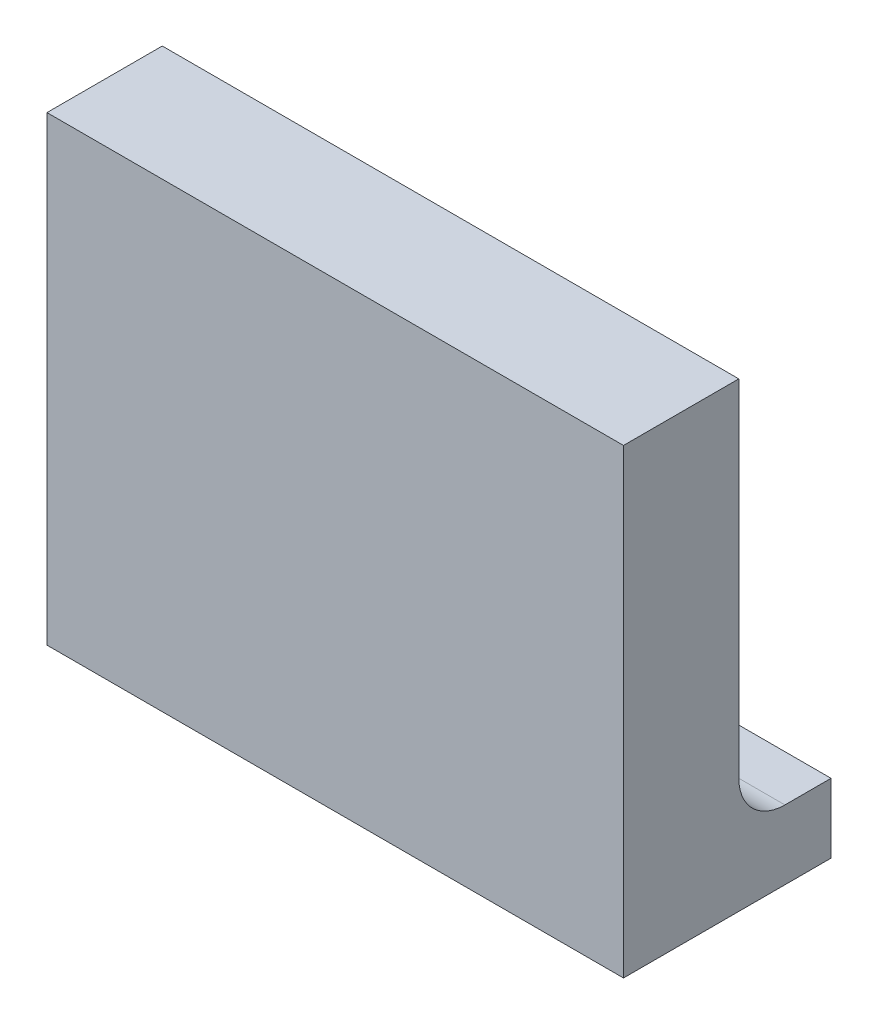
ISO-10303-21;
HEADER;
FILE_DESCRIPTION(('STEP AP214'),'2;1');
FILE_NAME('part.step','',(''),(''),'','','');
FILE_SCHEMA(('AUTOMOTIVE_DESIGN { 1 0 10303 214 1 1 1 1 }'));
ENDSEC;
DATA;
#1=APPLICATION_CONTEXT('core data for automotive mechanical design processes');
#2=APPLICATION_PROTOCOL_DEFINITION('international standard','automotive_design',2000,#1);
#3=PRODUCT_CONTEXT('',#1,'mechanical');
#4=PRODUCT('Part','Part','',(#3));
#5=PRODUCT_RELATED_PRODUCT_CATEGORY('part','',(#4));
#6=PRODUCT_DEFINITION_FORMATION('','',#4);
#7=PRODUCT_DEFINITION_CONTEXT('part definition',#1,'design');
#8=PRODUCT_DEFINITION('design','',#6,#7);
#9=PRODUCT_DEFINITION_SHAPE('','',#8);
#10=(LENGTH_UNIT() NAMED_UNIT(*) SI_UNIT(.MILLI.,.METRE.));
#11=(NAMED_UNIT(*) PLANE_ANGLE_UNIT() SI_UNIT($,.RADIAN.));
#12=(NAMED_UNIT(*) SI_UNIT($,.STERADIAN.) SOLID_ANGLE_UNIT());
#13=UNCERTAINTY_MEASURE_WITH_UNIT(LENGTH_MEASURE(1.E-05),#10,'distance_accuracy_value','');
#14=(GEOMETRIC_REPRESENTATION_CONTEXT(3) GLOBAL_UNCERTAINTY_ASSIGNED_CONTEXT((#13)) GLOBAL_UNIT_ASSIGNED_CONTEXT((#10,
#11,#12)) REPRESENTATION_CONTEXT('',''));
#15=CARTESIAN_POINT('',(0.,0.,0.));
#16=DIRECTION('',(0.,0.,1.));
#17=DIRECTION('',(1.,0.,0.));
#18=AXIS2_PLACEMENT_3D('',#15,#16,#17);
#19=CARTESIAN_POINT('',(25.,3.,0.));
#20=DIRECTION('',(0.,0.,1.));
#21=DIRECTION('',(1.,0.,0.));
#22=AXIS2_PLACEMENT_3D('',#19,#20,#21);
#23=PLANE('',#22);
#24=DIRECTION('',(0.,1.,0.));
#25=VECTOR('',#24,1.);
#26=CARTESIAN_POINT('',(0.,3.,0.));
#27=LINE('',#26,#25);
#28=CARTESIAN_POINT('',(0.,0.,0.));
#29=VERTEX_POINT('',#28);
#30=CARTESIAN_POINT('',(0.,3.,0.));
#31=VERTEX_POINT('',#30);
#32=EDGE_CURVE('E109',#29,#31,#27,.T.);
#33=ORIENTED_EDGE('',*,*,#32,.T.);
#34=DIRECTION('',(-1.,0.,0.));
#35=VECTOR('',#34,1.);
#36=CARTESIAN_POINT('',(25.,3.,0.));
#37=LINE('',#36,#35);
#38=CARTESIAN_POINT('',(25.,3.,0.));
#39=VERTEX_POINT('',#38);
#40=EDGE_CURVE('E92',#39,#31,#37,.T.);
#41=ORIENTED_EDGE('',*,*,#40,.F.);
#42=DIRECTION('',(0.,1.,0.));
#43=VECTOR('',#42,1.);
#44=CARTESIAN_POINT('',(25.,3.,0.));
#45=LINE('',#44,#43);
#46=CARTESIAN_POINT('',(25.,0.,0.));
#47=VERTEX_POINT('',#46);
#48=EDGE_CURVE('E97',#47,#39,#45,.T.);
#49=ORIENTED_EDGE('',*,*,#48,.F.);
#50=DIRECTION('',(-1.,0.,0.));
#51=VECTOR('',#50,1.);
#52=CARTESIAN_POINT('',(25.,0.,0.));
#53=LINE('',#52,#51);
#54=EDGE_CURVE('E125',#47,#29,#53,.T.);
#55=ORIENTED_EDGE('',*,*,#54,.T.);
#56=EDGE_LOOP('',(#33,#41,#49,#55));
#57=FACE_BOUND('',#56,.T.);
#58=ADVANCED_FACE('F33',(#57),#23,.F.);
#59=CARTESIAN_POINT('',(25.,3.,4.));
#60=DIRECTION('',(0.,-1.,0.));
#61=DIRECTION('',(0.,0.,-1.));
#62=AXIS2_PLACEMENT_3D('',#59,#60,#61);
#63=PLANE('',#62);
#64=DIRECTION('',(0.,0.,1.));
#65=VECTOR('',#64,1.);
#66=CARTESIAN_POINT('',(0.,3.,4.));
#67=LINE('',#66,#65);
#68=CARTESIAN_POINT('',(0.,3.,2.));
#69=VERTEX_POINT('',#68);
#70=EDGE_CURVE('E134',#31,#69,#67,.T.);
#71=ORIENTED_EDGE('',*,*,#70,.T.);
#72=DIRECTION('',(-1.,0.,0.));
#73=VECTOR('',#72,1.);
#74=CARTESIAN_POINT('',(25.,3.,2.));
#75=LINE('',#74,#73);
#76=CARTESIAN_POINT('',(25.,3.,2.));
#77=VERTEX_POINT('',#76);
#78=EDGE_CURVE('E48',#69,#77,#75,.F.);
#79=ORIENTED_EDGE('',*,*,#78,.T.);
#80=DIRECTION('',(0.,0.,1.));
#81=VECTOR('',#80,1.);
#82=CARTESIAN_POINT('',(25.,3.,4.));
#83=LINE('',#82,#81);
#84=EDGE_CURVE('E88',#39,#77,#83,.T.);
#85=ORIENTED_EDGE('',*,*,#84,.F.);
#86=ORIENTED_EDGE('',*,*,#40,.T.);
#87=EDGE_LOOP('',(#71,#79,#85,#86));
#88=FACE_BOUND('',#87,.T.);
#89=ADVANCED_FACE('F90',(#88),#63,.F.);
#90=CARTESIAN_POINT('',(25.,20.,4.));
#91=DIRECTION('',(0.,0.,1.));
#92=DIRECTION('',(0.,-1.,0.));
#93=AXIS2_PLACEMENT_3D('',#90,#91,#92);
#94=PLANE('',#93);
#95=DIRECTION('',(0.,1.,0.));
#96=VECTOR('',#95,1.);
#97=CARTESIAN_POINT('',(25.,20.,4.));
#98=LINE('',#97,#96);
#99=CARTESIAN_POINT('',(25.,5.,4.));
#100=VERTEX_POINT('',#99);
#101=CARTESIAN_POINT('',(25.,20.,4.));
#102=VERTEX_POINT('',#101);
#103=EDGE_CURVE('E96',#100,#102,#98,.T.);
#104=ORIENTED_EDGE('',*,*,#103,.F.);
#105=DIRECTION('',(-1.,0.,0.));
#106=VECTOR('',#105,1.);
#107=CARTESIAN_POINT('',(0.,5.,4.));
#108=LINE('',#107,#106);
#109=CARTESIAN_POINT('',(0.,5.,4.));
#110=VERTEX_POINT('',#109);
#111=EDGE_CURVE('E110',#100,#110,#108,.T.);
#112=ORIENTED_EDGE('',*,*,#111,.T.);
#113=DIRECTION('',(0.,1.,0.));
#114=VECTOR('',#113,1.);
#115=CARTESIAN_POINT('',(0.,20.,4.));
#116=LINE('',#115,#114);
#117=CARTESIAN_POINT('',(0.,20.,4.));
#118=VERTEX_POINT('',#117);
#119=EDGE_CURVE('E132',#110,#118,#116,.T.);
#120=ORIENTED_EDGE('',*,*,#119,.T.);
#121=DIRECTION('',(-1.,0.,0.));
#122=VECTOR('',#121,1.);
#123=CARTESIAN_POINT('',(25.,20.,4.));
#124=LINE('',#123,#122);
#125=EDGE_CURVE('E111',#102,#118,#124,.T.);
#126=ORIENTED_EDGE('',*,*,#125,.F.);
#127=EDGE_LOOP('',(#104,#112,#120,#126));
#128=FACE_BOUND('',#127,.T.);
#129=ADVANCED_FACE('F148',(#128),#94,.F.);
#130=CARTESIAN_POINT('',(25.,20.,9.));
#131=DIRECTION('',(0.,-1.,0.));
#132=DIRECTION('',(0.,0.,-1.));
#133=AXIS2_PLACEMENT_3D('',#130,#131,#132);
#134=PLANE('',#133);
#135=DIRECTION('',(0.,0.,1.));
#136=VECTOR('',#135,1.);
#137=CARTESIAN_POINT('',(0.,20.,9.));
#138=LINE('',#137,#136);
#139=CARTESIAN_POINT('',(0.,20.,9.));
#140=VERTEX_POINT('',#139);
#141=EDGE_CURVE('E130',#118,#140,#138,.T.);
#142=ORIENTED_EDGE('',*,*,#141,.T.);
#143=DIRECTION('',(-1.,0.,0.));
#144=VECTOR('',#143,1.);
#145=CARTESIAN_POINT('',(25.,20.,9.));
#146=LINE('',#145,#144);
#147=CARTESIAN_POINT('',(25.,20.,9.));
#148=VERTEX_POINT('',#147);
#149=EDGE_CURVE('E116',#148,#140,#146,.T.);
#150=ORIENTED_EDGE('',*,*,#149,.F.);
#151=DIRECTION('',(0.,0.,1.));
#152=VECTOR('',#151,1.);
#153=CARTESIAN_POINT('',(25.,20.,9.));
#154=LINE('',#153,#152);
#155=EDGE_CURVE('E140',#102,#148,#154,.T.);
#156=ORIENTED_EDGE('',*,*,#155,.F.);
#157=ORIENTED_EDGE('',*,*,#125,.T.);
#158=EDGE_LOOP('',(#142,#150,#156,#157));
#159=FACE_BOUND('',#158,.T.);
#160=ADVANCED_FACE('F151',(#159),#134,.F.);
#161=CARTESIAN_POINT('',(25.,0.,9.));
#162=DIRECTION('',(0.,0.,-1.));
#163=DIRECTION('',(-1.,0.,0.));
#164=AXIS2_PLACEMENT_3D('',#161,#162,#163);
#165=PLANE('',#164);
#166=DIRECTION('',(0.,-1.,0.));
#167=VECTOR('',#166,1.);
#168=CARTESIAN_POINT('',(0.,0.,9.));
#169=LINE('',#168,#167);
#170=CARTESIAN_POINT('',(0.,0.,9.));
#171=VERTEX_POINT('',#170);
#172=EDGE_CURVE('E128',#140,#171,#169,.T.);
#173=ORIENTED_EDGE('',*,*,#172,.T.);
#174=DIRECTION('',(-1.,0.,0.));
#175=VECTOR('',#174,1.);
#176=CARTESIAN_POINT('',(25.,0.,9.));
#177=LINE('',#176,#175);
#178=CARTESIAN_POINT('',(25.,0.,9.));
#179=VERTEX_POINT('',#178);
#180=EDGE_CURVE('E122',#179,#171,#177,.T.);
#181=ORIENTED_EDGE('',*,*,#180,.F.);
#182=DIRECTION('',(0.,-1.,0.));
#183=VECTOR('',#182,1.);
#184=CARTESIAN_POINT('',(25.,0.,9.));
#185=LINE('',#184,#183);
#186=EDGE_CURVE('E138',#148,#179,#185,.T.);
#187=ORIENTED_EDGE('',*,*,#186,.F.);
#188=ORIENTED_EDGE('',*,*,#149,.T.);
#189=EDGE_LOOP('',(#173,#181,#187,#188));
#190=FACE_BOUND('',#189,.T.);
#191=ADVANCED_FACE('F156',(#190),#165,.F.);
#192=CARTESIAN_POINT('',(25.,0.,0.));
#193=DIRECTION('',(0.,1.,0.));
#194=DIRECTION('',(0.,0.,1.));
#195=AXIS2_PLACEMENT_3D('',#192,#193,#194);
#196=PLANE('',#195);
#197=DIRECTION('',(0.,0.,-1.));
#198=VECTOR('',#197,1.);
#199=CARTESIAN_POINT('',(0.,0.,0.));
#200=LINE('',#199,#198);
#201=EDGE_CURVE('E106',#171,#29,#200,.T.);
#202=ORIENTED_EDGE('',*,*,#201,.T.);
#203=ORIENTED_EDGE('',*,*,#54,.F.);
#204=DIRECTION('',(0.,0.,-1.));
#205=VECTOR('',#204,1.);
#206=CARTESIAN_POINT('',(25.,0.,0.));
#207=LINE('',#206,#205);
#208=EDGE_CURVE('E102',#179,#47,#207,.T.);
#209=ORIENTED_EDGE('',*,*,#208,.F.);
#210=ORIENTED_EDGE('',*,*,#180,.T.);
#211=EDGE_LOOP('',(#202,#203,#209,#210));
#212=FACE_BOUND('',#211,.T.);
#213=ADVANCED_FACE('F159',(#212),#196,.F.);
#214=CARTESIAN_POINT('',(25.,0.,0.));
#215=DIRECTION('',(-1.,0.,0.));
#216=DIRECTION('',(0.,0.,1.));
#217=AXIS2_PLACEMENT_3D('',#214,#215,#216);
#218=PLANE('',#217);
#219=ORIENTED_EDGE('',*,*,#48,.T.);
#220=ORIENTED_EDGE('',*,*,#84,.T.);
#221=CARTESIAN_POINT('',(25.,5.,2.));
#222=DIRECTION('',(-1.,0.,0.));
#223=DIRECTION('',(0.,0.,1.));
#224=AXIS2_PLACEMENT_3D('',#221,#222,#223);
#225=CIRCLE('',#224,2.);
#226=EDGE_CURVE('E11',#77,#100,#225,.T.);
#227=ORIENTED_EDGE('',*,*,#226,.T.);
#228=ORIENTED_EDGE('',*,*,#103,.T.);
#229=ORIENTED_EDGE('',*,*,#155,.T.);
#230=ORIENTED_EDGE('',*,*,#186,.T.);
#231=ORIENTED_EDGE('',*,*,#208,.T.);
#232=EDGE_LOOP('',(#219,#220,#227,#228,#229,#230,#231));
#233=FACE_BOUND('',#232,.T.);
#234=ADVANCED_FACE('F100',(#233),#218,.F.);
#235=CARTESIAN_POINT('',(0.,0.,0.));
#236=DIRECTION('',(-1.,0.,0.));
#237=DIRECTION('',(0.,0.,1.));
#238=AXIS2_PLACEMENT_3D('',#235,#236,#237);
#239=PLANE('',#238);
#240=ORIENTED_EDGE('',*,*,#32,.F.);
#241=ORIENTED_EDGE('',*,*,#201,.F.);
#242=ORIENTED_EDGE('',*,*,#172,.F.);
#243=ORIENTED_EDGE('',*,*,#141,.F.);
#244=ORIENTED_EDGE('',*,*,#119,.F.);
#245=CARTESIAN_POINT('',(0.,5.,2.));
#246=DIRECTION('',(-1.,0.,0.));
#247=DIRECTION('',(0.,0.,1.));
#248=AXIS2_PLACEMENT_3D('',#245,#246,#247);
#249=CIRCLE('',#248,2.);
#250=EDGE_CURVE('E41',#110,#69,#249,.F.);
#251=ORIENTED_EDGE('',*,*,#250,.T.);
#252=ORIENTED_EDGE('',*,*,#70,.F.);
#253=EDGE_LOOP('',(#240,#241,#242,#243,#244,#251,#252));
#254=FACE_BOUND('',#253,.T.);
#255=ADVANCED_FACE('F160',(#254),#239,.T.);
#256=CARTESIAN_POINT('',(25.,5.,2.));
#257=DIRECTION('',(1.,0.,0.));
#258=DIRECTION('',(0.,0.,-1.));
#259=AXIS2_PLACEMENT_3D('',#256,#257,#258);
#260=CYLINDRICAL_SURFACE('',#259,2.);
#261=ORIENTED_EDGE('',*,*,#226,.F.);
#262=ORIENTED_EDGE('',*,*,#78,.F.);
#263=ORIENTED_EDGE('',*,*,#250,.F.);
#264=ORIENTED_EDGE('',*,*,#111,.F.);
#265=EDGE_LOOP('',(#261,#262,#263,#264));
#266=FACE_BOUND('',#265,.T.);
#267=ADVANCED_FACE('F35',(#266),#260,.F.);
#268=CLOSED_SHELL('',(#58,#89,#129,#160,#191,#213,#234,#255,#267));
#269=MANIFOLD_SOLID_BREP('B2',#268);
#270=ADVANCED_BREP_SHAPE_REPRESENTATION('',(#18,#269),#14);
#271=SHAPE_DEFINITION_REPRESENTATION(#9,#270);
ENDSEC;
END-ISO-10303-21;
